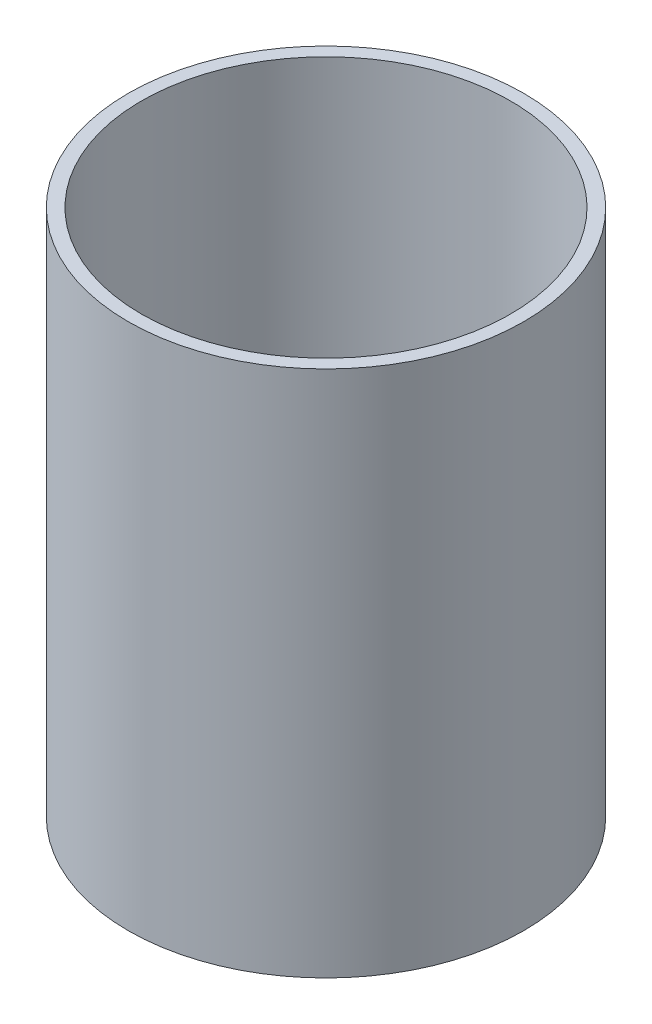
ISO-10303-21;
HEADER;
FILE_DESCRIPTION(('STEP AP214'),'2;1');
FILE_NAME('part.step','',(''),(''),'','','');
FILE_SCHEMA(('AUTOMOTIVE_DESIGN { 1 0 10303 214 1 1 1 1 }'));
ENDSEC;
DATA;
#1=APPLICATION_CONTEXT('core data for automotive mechanical design processes');
#2=APPLICATION_PROTOCOL_DEFINITION('international standard','automotive_design',2000,#1);
#3=PRODUCT_CONTEXT('',#1,'mechanical');
#4=PRODUCT('Part','Part','',(#3));
#5=PRODUCT_RELATED_PRODUCT_CATEGORY('part','',(#4));
#6=PRODUCT_DEFINITION_FORMATION('','',#4);
#7=PRODUCT_DEFINITION_CONTEXT('part definition',#1,'design');
#8=PRODUCT_DEFINITION('design','',#6,#7);
#9=PRODUCT_DEFINITION_SHAPE('','',#8);
#10=(LENGTH_UNIT() NAMED_UNIT(*) SI_UNIT(.MILLI.,.METRE.));
#11=(NAMED_UNIT(*) PLANE_ANGLE_UNIT() SI_UNIT($,.RADIAN.));
#12=(NAMED_UNIT(*) SI_UNIT($,.STERADIAN.) SOLID_ANGLE_UNIT());
#13=UNCERTAINTY_MEASURE_WITH_UNIT(LENGTH_MEASURE(1.E-05),#10,'distance_accuracy_value','');
#14=(GEOMETRIC_REPRESENTATION_CONTEXT(3) GLOBAL_UNCERTAINTY_ASSIGNED_CONTEXT((#13)) GLOBAL_UNIT_ASSIGNED_CONTEXT((#10,
#11,#12)) REPRESENTATION_CONTEXT('',''));
#15=CARTESIAN_POINT('',(0.,0.,0.));
#16=DIRECTION('',(0.,0.,1.));
#17=DIRECTION('',(1.,0.,0.));
#18=AXIS2_PLACEMENT_3D('',#15,#16,#17);
#19=CARTESIAN_POINT('',(0.,0.,0.));
#20=DIRECTION('',(0.,-1.,0.));
#21=DIRECTION('',(0.,0.,-1.));
#22=AXIS2_PLACEMENT_3D('',#19,#20,#21);
#23=CYLINDRICAL_SURFACE('',#22,15.);
#24=CARTESIAN_POINT('',(0.,-40.,0.));
#25=DIRECTION('',(0.,1.,0.));
#26=DIRECTION('',(0.,0.,1.));
#27=AXIS2_PLACEMENT_3D('',#24,#25,#26);
#28=CIRCLE('',#27,15.);
#29=CARTESIAN_POINT('',(0.,-40.,15.));
#30=VERTEX_POINT('',#29);
#31=EDGE_CURVE('E44',#30,#30,#28,.T.);
#32=ORIENTED_EDGE('',*,*,#31,.T.);
#33=EDGE_LOOP('',(#32));
#34=FACE_BOUND('',#33,.T.);
#35=CARTESIAN_POINT('',(0.,0.,0.));
#36=DIRECTION('',(0.,1.,0.));
#37=DIRECTION('',(0.,0.,1.));
#38=AXIS2_PLACEMENT_3D('',#35,#36,#37);
#39=CIRCLE('',#38,15.);
#40=CARTESIAN_POINT('',(0.,0.,15.));
#41=VERTEX_POINT('',#40);
#42=EDGE_CURVE('E35',#41,#41,#39,.T.);
#43=ORIENTED_EDGE('',*,*,#42,.F.);
#44=EDGE_LOOP('',(#43));
#45=FACE_BOUND('',#44,.T.);
#46=ADVANCED_FACE('F32',(#34,#45),#23,.T.);
#47=CARTESIAN_POINT('',(0.,0.,0.));
#48=DIRECTION('',(0.,1.,0.));
#49=DIRECTION('',(0.,0.,1.));
#50=AXIS2_PLACEMENT_3D('',#47,#48,#49);
#51=PLANE('',#50);
#52=CARTESIAN_POINT('',(0.,0.,0.));
#53=DIRECTION('',(0.,1.,0.));
#54=DIRECTION('',(0.,0.,1.));
#55=AXIS2_PLACEMENT_3D('',#52,#53,#54);
#56=CIRCLE('',#55,14.);
#57=CARTESIAN_POINT('',(0.,0.,14.));
#58=VERTEX_POINT('',#57);
#59=EDGE_CURVE('E39',#58,#58,#56,.F.);
#60=ORIENTED_EDGE('',*,*,#59,.T.);
#61=EDGE_LOOP('',(#60));
#62=FACE_BOUND('',#61,.T.);
#63=ORIENTED_EDGE('',*,*,#42,.T.);
#64=EDGE_LOOP('',(#63));
#65=FACE_BOUND('',#64,.T.);
#66=ADVANCED_FACE('F52',(#62,#65),#51,.T.);
#67=CARTESIAN_POINT('',(0.,-40.,0.));
#68=DIRECTION('',(0.,1.,0.));
#69=DIRECTION('',(0.,0.,1.));
#70=AXIS2_PLACEMENT_3D('',#67,#68,#69);
#71=PLANE('',#70);
#72=CARTESIAN_POINT('',(0.,-40.,0.));
#73=DIRECTION('',(0.,1.,0.));
#74=DIRECTION('',(0.,0.,1.));
#75=AXIS2_PLACEMENT_3D('',#72,#73,#74);
#76=CIRCLE('',#75,14.);
#77=CARTESIAN_POINT('',(0.,-40.,14.));
#78=VERTEX_POINT('',#77);
#79=EDGE_CURVE('E10',#78,#78,#76,.F.);
#80=ORIENTED_EDGE('',*,*,#79,.F.);
#81=EDGE_LOOP('',(#80));
#82=FACE_BOUND('',#81,.T.);
#83=ORIENTED_EDGE('',*,*,#31,.F.);
#84=EDGE_LOOP('',(#83));
#85=FACE_BOUND('',#84,.T.);
#86=ADVANCED_FACE('F58',(#82,#85),#71,.F.);
#87=CARTESIAN_POINT('',(0.,0.,0.));
#88=DIRECTION('',(0.,-1.,0.));
#89=DIRECTION('',(0.,0.,-1.));
#90=AXIS2_PLACEMENT_3D('',#87,#88,#89);
#91=CYLINDRICAL_SURFACE('',#90,14.);
#92=ORIENTED_EDGE('',*,*,#79,.T.);
#93=EDGE_LOOP('',(#92));
#94=FACE_BOUND('',#93,.T.);
#95=ORIENTED_EDGE('',*,*,#59,.F.);
#96=EDGE_LOOP('',(#95));
#97=FACE_BOUND('',#96,.T.);
#98=ADVANCED_FACE('F60',(#94,#97),#91,.F.);
#99=CLOSED_SHELL('',(#46,#66,#86,#98));
#100=MANIFOLD_SOLID_BREP('B2',#99);
#101=ADVANCED_BREP_SHAPE_REPRESENTATION('',(#18,#100),#14);
#102=SHAPE_DEFINITION_REPRESENTATION(#9,#101);
ENDSEC;
END-ISO-10303-21;
